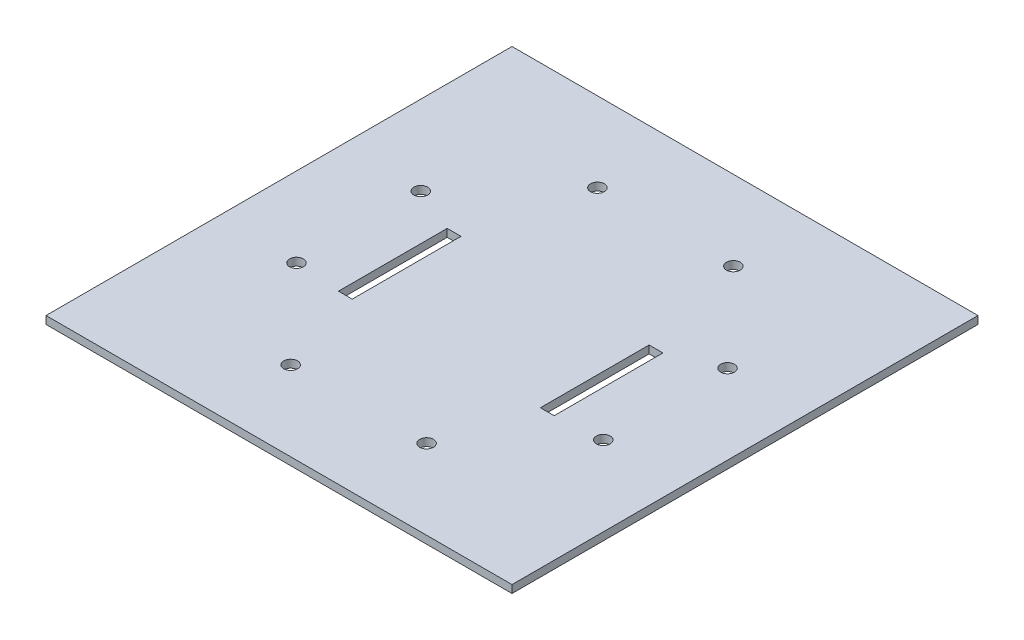
ISO-10303-21;
HEADER;
FILE_DESCRIPTION(('STEP AP214'),'2;1');
FILE_NAME('part.step','',(''),(''),'','','');
FILE_SCHEMA(('AUTOMOTIVE_DESIGN { 1 0 10303 214 1 1 1 1 }'));
ENDSEC;
DATA;
#1=APPLICATION_CONTEXT('core data for automotive mechanical design processes');
#2=APPLICATION_PROTOCOL_DEFINITION('international standard','automotive_design',2000,#1);
#3=PRODUCT_CONTEXT('',#1,'mechanical');
#4=PRODUCT('Part','Part','',(#3));
#5=PRODUCT_RELATED_PRODUCT_CATEGORY('part','',(#4));
#6=PRODUCT_DEFINITION_FORMATION('','',#4);
#7=PRODUCT_DEFINITION_CONTEXT('part definition',#1,'design');
#8=PRODUCT_DEFINITION('design','',#6,#7);
#9=PRODUCT_DEFINITION_SHAPE('','',#8);
#10=(LENGTH_UNIT() NAMED_UNIT(*) SI_UNIT(.MILLI.,.METRE.));
#11=(NAMED_UNIT(*) PLANE_ANGLE_UNIT() SI_UNIT($,.RADIAN.));
#12=(NAMED_UNIT(*) SI_UNIT($,.STERADIAN.) SOLID_ANGLE_UNIT());
#13=UNCERTAINTY_MEASURE_WITH_UNIT(LENGTH_MEASURE(1.E-05),#10,'distance_accuracy_value','');
#14=(GEOMETRIC_REPRESENTATION_CONTEXT(3) GLOBAL_UNCERTAINTY_ASSIGNED_CONTEXT((#13)) GLOBAL_UNIT_ASSIGNED_CONTEXT((#10,
#11,#12)) REPRESENTATION_CONTEXT('',''));
#15=CARTESIAN_POINT('',(0.,0.,0.));
#16=DIRECTION('',(0.,0.,1.));
#17=DIRECTION('',(1.,0.,0.));
#18=AXIS2_PLACEMENT_3D('',#15,#16,#17);
#19=CARTESIAN_POINT('',(44.8799955021159,2.,-74.7331424372196));
#20=DIRECTION('',(1.,0.,0.));
#21=DIRECTION('',(0.,0.,-1.));
#22=AXIS2_PLACEMENT_3D('',#19,#20,#21);
#23=PLANE('',#22);
#24=DIRECTION('',(0.,0.,1.));
#25=VECTOR('',#24,1.);
#26=CARTESIAN_POINT('',(44.8799955021159,0.,-74.7331424372196));
#27=LINE('',#26,#25);
#28=CARTESIAN_POINT('',(44.8799955021159,0.,-74.7331424372196));
#29=VERTEX_POINT('',#28);
#30=CARTESIAN_POINT('',(44.879995502116,0.,45.2668575627803));
#31=VERTEX_POINT('',#30);
#32=EDGE_CURVE('E234',#29,#31,#27,.T.);
#33=ORIENTED_EDGE('',*,*,#32,.T.);
#34=DIRECTION('',(0.,-1.,0.));
#35=VECTOR('',#34,1.);
#36=CARTESIAN_POINT('',(44.879995502116,2.,45.2668575627803));
#37=LINE('',#36,#35);
#38=CARTESIAN_POINT('',(44.879995502116,2.,45.2668575627803));
#39=VERTEX_POINT('',#38);
#40=EDGE_CURVE('E11',#39,#31,#37,.T.);
#41=ORIENTED_EDGE('',*,*,#40,.F.);
#42=DIRECTION('',(0.,0.,1.));
#43=VECTOR('',#42,1.);
#44=CARTESIAN_POINT('',(44.8799955021159,2.,-74.7331424372196));
#45=LINE('',#44,#43);
#46=CARTESIAN_POINT('',(44.8799955021159,2.,-74.7331424372196));
#47=VERTEX_POINT('',#46);
#48=EDGE_CURVE('E237',#47,#39,#45,.T.);
#49=ORIENTED_EDGE('',*,*,#48,.F.);
#50=DIRECTION('',(0.,-1.,0.));
#51=VECTOR('',#50,1.);
#52=CARTESIAN_POINT('',(44.8799955021159,2.,-74.7331424372196));
#53=LINE('',#52,#51);
#54=EDGE_CURVE('E247',#47,#29,#53,.T.);
#55=ORIENTED_EDGE('',*,*,#54,.T.);
#56=EDGE_LOOP('',(#33,#41,#49,#55));
#57=FACE_BOUND('',#56,.T.);
#58=ADVANCED_FACE('F32',(#57),#23,.F.);
#59=CARTESIAN_POINT('',(44.879995502116,2.,45.2668575627803));
#60=DIRECTION('',(0.,0.,-1.));
#61=DIRECTION('',(-1.,0.,0.));
#62=AXIS2_PLACEMENT_3D('',#59,#60,#61);
#63=PLANE('',#62);
#64=DIRECTION('',(1.,0.,0.));
#65=VECTOR('',#64,1.);
#66=CARTESIAN_POINT('',(44.879995502116,0.,45.2668575627803));
#67=LINE('',#66,#65);
#68=CARTESIAN_POINT('',(164.879995502116,0.,45.2668575627803));
#69=VERTEX_POINT('',#68);
#70=EDGE_CURVE('E250',#31,#69,#67,.T.);
#71=ORIENTED_EDGE('',*,*,#70,.T.);
#72=DIRECTION('',(0.,-1.,0.));
#73=VECTOR('',#72,1.);
#74=CARTESIAN_POINT('',(164.879995502116,2.,45.2668575627803));
#75=LINE('',#74,#73);
#76=CARTESIAN_POINT('',(164.879995502116,2.,45.2668575627803));
#77=VERTEX_POINT('',#76);
#78=EDGE_CURVE('E39',#77,#69,#75,.T.);
#79=ORIENTED_EDGE('',*,*,#78,.F.);
#80=DIRECTION('',(1.,0.,0.));
#81=VECTOR('',#80,1.);
#82=CARTESIAN_POINT('',(44.879995502116,2.,45.2668575627803));
#83=LINE('',#82,#81);
#84=EDGE_CURVE('E240',#39,#77,#83,.T.);
#85=ORIENTED_EDGE('',*,*,#84,.F.);
#86=ORIENTED_EDGE('',*,*,#40,.T.);
#87=EDGE_LOOP('',(#71,#79,#85,#86));
#88=FACE_BOUND('',#87,.T.);
#89=ADVANCED_FACE('F279',(#88),#63,.F.);
#90=CARTESIAN_POINT('',(164.879995502116,2.,-74.7331424372197));
#91=DIRECTION('',(-1.,0.,0.));
#92=DIRECTION('',(0.,0.,1.));
#93=AXIS2_PLACEMENT_3D('',#90,#91,#92);
#94=PLANE('',#93);
#95=DIRECTION('',(0.,0.,-1.));
#96=VECTOR('',#95,1.);
#97=CARTESIAN_POINT('',(164.879995502116,0.,-74.7331424372197));
#98=LINE('',#97,#96);
#99=CARTESIAN_POINT('',(164.879995502116,0.,-74.7331424372197));
#100=VERTEX_POINT('',#99);
#101=EDGE_CURVE('E252',#69,#100,#98,.T.);
#102=ORIENTED_EDGE('',*,*,#101,.T.);
#103=DIRECTION('',(0.,-1.,0.));
#104=VECTOR('',#103,1.);
#105=CARTESIAN_POINT('',(164.879995502116,2.,-74.7331424372197));
#106=LINE('',#105,#104);
#107=CARTESIAN_POINT('',(164.879995502116,2.,-74.7331424372197));
#108=VERTEX_POINT('',#107);
#109=EDGE_CURVE('E257',#108,#100,#106,.T.);
#110=ORIENTED_EDGE('',*,*,#109,.F.);
#111=DIRECTION('',(0.,0.,-1.));
#112=VECTOR('',#111,1.);
#113=CARTESIAN_POINT('',(164.879995502116,2.,-74.7331424372197));
#114=LINE('',#113,#112);
#115=EDGE_CURVE('E243',#77,#108,#114,.T.);
#116=ORIENTED_EDGE('',*,*,#115,.F.);
#117=ORIENTED_EDGE('',*,*,#78,.T.);
#118=EDGE_LOOP('',(#102,#110,#116,#117));
#119=FACE_BOUND('',#118,.T.);
#120=ADVANCED_FACE('F264',(#119),#94,.F.);
#121=CARTESIAN_POINT('',(44.8799955021159,2.,-74.7331424372196));
#122=DIRECTION('',(0.,0.,1.));
#123=DIRECTION('',(1.,0.,0.));
#124=AXIS2_PLACEMENT_3D('',#121,#122,#123);
#125=PLANE('',#124);
#126=DIRECTION('',(-1.,0.,0.));
#127=VECTOR('',#126,1.);
#128=CARTESIAN_POINT('',(44.8799955021159,0.,-74.7331424372196));
#129=LINE('',#128,#127);
#130=EDGE_CURVE('E241',#100,#29,#129,.T.);
#131=ORIENTED_EDGE('',*,*,#130,.T.);
#132=ORIENTED_EDGE('',*,*,#54,.F.);
#133=DIRECTION('',(-1.,0.,0.));
#134=VECTOR('',#133,1.);
#135=CARTESIAN_POINT('',(44.8799955021159,2.,-74.7331424372196));
#136=LINE('',#135,#134);
#137=EDGE_CURVE('E245',#108,#47,#136,.T.);
#138=ORIENTED_EDGE('',*,*,#137,.F.);
#139=ORIENTED_EDGE('',*,*,#109,.T.);
#140=EDGE_LOOP('',(#131,#132,#138,#139));
#141=FACE_BOUND('',#140,.T.);
#142=ADVANCED_FACE('F272',(#141),#125,.F.);
#143=CARTESIAN_POINT('',(0.,2.,0.));
#144=DIRECTION('',(0.,1.,0.));
#145=DIRECTION('',(0.,0.,1.));
#146=AXIS2_PLACEMENT_3D('',#143,#144,#145);
#147=PLANE('',#146);
#148=DIRECTION('',(0.,0.,1.));
#149=VECTOR('',#148,1.);
#150=CARTESIAN_POINT('',(129.104995502116,2.,2.17958786240887));
#151=LINE('',#150,#149);
#152=CARTESIAN_POINT('',(129.104995502116,2.,-25.8204121375911));
#153=VERTEX_POINT('',#152);
#154=CARTESIAN_POINT('',(129.104995502116,2.,2.17958786240887));
#155=VERTEX_POINT('',#154);
#156=EDGE_CURVE('E46',#153,#155,#151,.T.);
#157=ORIENTED_EDGE('',*,*,#156,.F.);
#158=DIRECTION('',(-1.,0.,0.));
#159=VECTOR('',#158,1.);
#160=CARTESIAN_POINT('',(129.104995502116,2.,-25.8204121375911));
#161=LINE('',#160,#159);
#162=CARTESIAN_POINT('',(132.654995502116,2.,-25.8204121375911));
#163=VERTEX_POINT('',#162);
#164=EDGE_CURVE('E138',#163,#153,#161,.T.);
#165=ORIENTED_EDGE('',*,*,#164,.F.);
#166=DIRECTION('',(0.,0.,-1.));
#167=VECTOR('',#166,1.);
#168=CARTESIAN_POINT('',(132.654995502116,2.,2.17958786240887));
#169=LINE('',#168,#167);
#170=CARTESIAN_POINT('',(132.654995502116,2.,2.17958786240887));
#171=VERTEX_POINT('',#170);
#172=EDGE_CURVE('E141',#171,#163,#169,.T.);
#173=ORIENTED_EDGE('',*,*,#172,.F.);
#174=DIRECTION('',(1.,0.,0.));
#175=VECTOR('',#174,1.);
#176=CARTESIAN_POINT('',(129.104995502116,2.,2.17958786240887));
#177=LINE('',#176,#175);
#178=EDGE_CURVE('E147',#155,#171,#177,.T.);
#179=ORIENTED_EDGE('',*,*,#178,.F.);
#180=EDGE_LOOP('',(#157,#165,#173,#179));
#181=FACE_BOUND('',#180,.T.);
#182=DIRECTION('',(0.,0.,-1.));
#183=VECTOR('',#182,1.);
#184=CARTESIAN_POINT('',(80.6549955021159,2.,2.17958786240888));
#185=LINE('',#184,#183);
#186=CARTESIAN_POINT('',(80.6549955021159,2.,2.17958786240888));
#187=VERTEX_POINT('',#186);
#188=CARTESIAN_POINT('',(80.6549955021159,2.,-25.8204121375911));
#189=VERTEX_POINT('',#188);
#190=EDGE_CURVE('E153',#187,#189,#185,.T.);
#191=ORIENTED_EDGE('',*,*,#190,.F.);
#192=DIRECTION('',(1.,0.,0.));
#193=VECTOR('',#192,1.);
#194=CARTESIAN_POINT('',(80.6549955021159,2.,2.17958786240888));
#195=LINE('',#194,#193);
#196=CARTESIAN_POINT('',(77.1049955021159,2.,2.17958786240888));
#197=VERTEX_POINT('',#196);
#198=EDGE_CURVE('E161',#197,#187,#195,.T.);
#199=ORIENTED_EDGE('',*,*,#198,.F.);
#200=DIRECTION('',(0.,0.,1.));
#201=VECTOR('',#200,1.);
#202=CARTESIAN_POINT('',(77.1049955021159,2.,2.17958786240888));
#203=LINE('',#202,#201);
#204=CARTESIAN_POINT('',(77.1049955021159,2.,-25.8204121375911));
#205=VERTEX_POINT('',#204);
#206=EDGE_CURVE('E175',#205,#197,#203,.T.);
#207=ORIENTED_EDGE('',*,*,#206,.F.);
#208=DIRECTION('',(-1.,0.,0.));
#209=VECTOR('',#208,1.);
#210=CARTESIAN_POINT('',(80.6549955021159,2.,-25.8204121375911));
#211=LINE('',#210,#209);
#212=EDGE_CURVE('E172',#189,#205,#211,.T.);
#213=ORIENTED_EDGE('',*,*,#212,.F.);
#214=EDGE_LOOP('',(#191,#199,#207,#213));
#215=FACE_BOUND('',#214,.T.);
#216=CARTESIAN_POINT('',(122.379995502116,2.,-54.2331424372197));
#217=DIRECTION('',(0.,1.,0.));
#218=DIRECTION('',(0.,0.,1.));
#219=AXIS2_PLACEMENT_3D('',#216,#217,#218);
#220=CIRCLE('',#219,1.77499999999999);
#221=CARTESIAN_POINT('',(122.379995502116,2.,-52.4581424372197));
#222=VERTEX_POINT('',#221);
#223=EDGE_CURVE('E182',#222,#222,#220,.T.);
#224=ORIENTED_EDGE('',*,*,#223,.F.);
#225=EDGE_LOOP('',(#224));
#226=FACE_BOUND('',#225,.T.);
#227=CARTESIAN_POINT('',(122.379995502116,2.,24.7668575627803));
#228=DIRECTION('',(0.,1.,0.));
#229=DIRECTION('',(0.,0.,1.));
#230=AXIS2_PLACEMENT_3D('',#227,#228,#229);
#231=CIRCLE('',#230,1.77499999999999);
#232=CARTESIAN_POINT('',(122.379995502116,2.,26.5418575627803));
#233=VERTEX_POINT('',#232);
#234=EDGE_CURVE('E192',#233,#233,#231,.T.);
#235=ORIENTED_EDGE('',*,*,#234,.F.);
#236=EDGE_LOOP('',(#235));
#237=FACE_BOUND('',#236,.T.);
#238=CARTESIAN_POINT('',(87.3799955021159,2.,-54.2331424372197));
#239=DIRECTION('',(0.,1.,0.));
#240=DIRECTION('',(0.,0.,1.));
#241=AXIS2_PLACEMENT_3D('',#238,#239,#240);
#242=CIRCLE('',#241,1.77499999999999);
#243=CARTESIAN_POINT('',(87.3799955021159,2.,-52.4581424372197));
#244=VERTEX_POINT('',#243);
#245=EDGE_CURVE('E198',#244,#244,#242,.T.);
#246=ORIENTED_EDGE('',*,*,#245,.F.);
#247=EDGE_LOOP('',(#246));
#248=FACE_BOUND('',#247,.T.);
#249=CARTESIAN_POINT('',(87.3799955021159,2.,24.7668575627803));
#250=DIRECTION('',(0.,1.,0.));
#251=DIRECTION('',(0.,0.,1.));
#252=AXIS2_PLACEMENT_3D('',#249,#250,#251);
#253=CIRCLE('',#252,1.77499999999999);
#254=CARTESIAN_POINT('',(87.3799955021159,2.,26.5418575627803));
#255=VERTEX_POINT('',#254);
#256=EDGE_CURVE('E204',#255,#255,#253,.T.);
#257=ORIENTED_EDGE('',*,*,#256,.F.);
#258=EDGE_LOOP('',(#257));
#259=FACE_BOUND('',#258,.T.);
#260=CARTESIAN_POINT('',(144.379995502116,2.,-30.7331424372197));
#261=DIRECTION('',(0.,1.,0.));
#262=DIRECTION('',(0.,0.,1.));
#263=AXIS2_PLACEMENT_3D('',#260,#261,#262);
#264=CIRCLE('',#263,1.77499999999999);
#265=CARTESIAN_POINT('',(144.379995502116,2.,-28.9581424372197));
#266=VERTEX_POINT('',#265);
#267=EDGE_CURVE('E210',#266,#266,#264,.T.);
#268=ORIENTED_EDGE('',*,*,#267,.F.);
#269=EDGE_LOOP('',(#268));
#270=FACE_BOUND('',#269,.T.);
#271=CARTESIAN_POINT('',(144.379995502116,2.,1.2668575627803));
#272=DIRECTION('',(0.,1.,0.));
#273=DIRECTION('',(0.,0.,1.));
#274=AXIS2_PLACEMENT_3D('',#271,#272,#273);
#275=CIRCLE('',#274,1.775);
#276=CARTESIAN_POINT('',(144.379995502116,2.,3.0418575627803));
#277=VERTEX_POINT('',#276);
#278=EDGE_CURVE('E216',#277,#277,#275,.T.);
#279=ORIENTED_EDGE('',*,*,#278,.F.);
#280=EDGE_LOOP('',(#279));
#281=FACE_BOUND('',#280,.T.);
#282=CARTESIAN_POINT('',(65.3799955021159,2.,1.2668575627803));
#283=DIRECTION('',(0.,1.,0.));
#284=DIRECTION('',(0.,0.,1.));
#285=AXIS2_PLACEMENT_3D('',#282,#283,#284);
#286=CIRCLE('',#285,1.775);
#287=CARTESIAN_POINT('',(65.3799955021159,2.,3.0418575627803));
#288=VERTEX_POINT('',#287);
#289=EDGE_CURVE('E222',#288,#288,#286,.T.);
#290=ORIENTED_EDGE('',*,*,#289,.F.);
#291=EDGE_LOOP('',(#290));
#292=FACE_BOUND('',#291,.T.);
#293=CARTESIAN_POINT('',(65.3799955021159,2.,-30.7331424372197));
#294=DIRECTION('',(0.,1.,0.));
#295=DIRECTION('',(0.,0.,1.));
#296=AXIS2_PLACEMENT_3D('',#293,#294,#295);
#297=CIRCLE('',#296,1.77499999999999);
#298=CARTESIAN_POINT('',(65.3799955021159,2.,-28.9581424372197));
#299=VERTEX_POINT('',#298);
#300=EDGE_CURVE('E228',#299,#299,#297,.T.);
#301=ORIENTED_EDGE('',*,*,#300,.F.);
#302=EDGE_LOOP('',(#301));
#303=FACE_BOUND('',#302,.T.);
#304=ORIENTED_EDGE('',*,*,#48,.T.);
#305=ORIENTED_EDGE('',*,*,#84,.T.);
#306=ORIENTED_EDGE('',*,*,#115,.T.);
#307=ORIENTED_EDGE('',*,*,#137,.T.);
#308=EDGE_LOOP('',(#304,#305,#306,#307));
#309=FACE_BOUND('',#308,.T.);
#310=ADVANCED_FACE('F278',(#181,#215,#226,#237,#248,#259,#270,#281,#292,#303,#309),#147,.T.);
#311=CARTESIAN_POINT('',(0.,0.,0.));
#312=DIRECTION('',(0.,1.,0.));
#313=DIRECTION('',(0.,0.,1.));
#314=AXIS2_PLACEMENT_3D('',#311,#312,#313);
#315=PLANE('',#314);
#316=DIRECTION('',(-1.,0.,0.));
#317=VECTOR('',#316,1.);
#318=CARTESIAN_POINT('',(129.104995502116,0.,-25.8204121375911));
#319=LINE('',#318,#317);
#320=CARTESIAN_POINT('',(132.654995502116,0.,-25.8204121375911));
#321=VERTEX_POINT('',#320);
#322=CARTESIAN_POINT('',(129.104995502116,0.,-25.8204121375911));
#323=VERTEX_POINT('',#322);
#324=EDGE_CURVE('E128',#321,#323,#319,.T.);
#325=ORIENTED_EDGE('',*,*,#324,.T.);
#326=DIRECTION('',(0.,0.,1.));
#327=VECTOR('',#326,1.);
#328=CARTESIAN_POINT('',(129.104995502116,0.,2.17958786240887));
#329=LINE('',#328,#327);
#330=CARTESIAN_POINT('',(129.104995502116,0.,2.17958786240887));
#331=VERTEX_POINT('',#330);
#332=EDGE_CURVE('E122',#323,#331,#329,.T.);
#333=ORIENTED_EDGE('',*,*,#332,.T.);
#334=DIRECTION('',(1.,0.,0.));
#335=VECTOR('',#334,1.);
#336=CARTESIAN_POINT('',(129.104995502116,0.,2.17958786240887));
#337=LINE('',#336,#335);
#338=CARTESIAN_POINT('',(132.654995502116,0.,2.17958786240887));
#339=VERTEX_POINT('',#338);
#340=EDGE_CURVE('E131',#331,#339,#337,.T.);
#341=ORIENTED_EDGE('',*,*,#340,.T.);
#342=DIRECTION('',(0.,0.,-1.));
#343=VECTOR('',#342,1.);
#344=CARTESIAN_POINT('',(132.654995502116,0.,2.17958786240887));
#345=LINE('',#344,#343);
#346=EDGE_CURVE('E54',#339,#321,#345,.T.);
#347=ORIENTED_EDGE('',*,*,#346,.T.);
#348=EDGE_LOOP('',(#325,#333,#341,#347));
#349=FACE_BOUND('',#348,.T.);
#350=DIRECTION('',(1.,0.,0.));
#351=VECTOR('',#350,1.);
#352=CARTESIAN_POINT('',(80.6549955021159,0.,2.17958786240888));
#353=LINE('',#352,#351);
#354=CARTESIAN_POINT('',(77.1049955021159,0.,2.17958786240888));
#355=VERTEX_POINT('',#354);
#356=CARTESIAN_POINT('',(80.6549955021159,0.,2.17958786240888));
#357=VERTEX_POINT('',#356);
#358=EDGE_CURVE('E167',#355,#357,#353,.T.);
#359=ORIENTED_EDGE('',*,*,#358,.T.);
#360=DIRECTION('',(0.,0.,-1.));
#361=VECTOR('',#360,1.);
#362=CARTESIAN_POINT('',(80.6549955021159,0.,2.17958786240888));
#363=LINE('',#362,#361);
#364=CARTESIAN_POINT('',(80.6549955021159,0.,-25.8204121375911));
#365=VERTEX_POINT('',#364);
#366=EDGE_CURVE('E157',#357,#365,#363,.T.);
#367=ORIENTED_EDGE('',*,*,#366,.T.);
#368=DIRECTION('',(-1.,0.,0.));
#369=VECTOR('',#368,1.);
#370=CARTESIAN_POINT('',(80.6549955021159,0.,-25.8204121375911));
#371=LINE('',#370,#369);
#372=CARTESIAN_POINT('',(77.1049955021159,0.,-25.8204121375911));
#373=VERTEX_POINT('',#372);
#374=EDGE_CURVE('E160',#365,#373,#371,.T.);
#375=ORIENTED_EDGE('',*,*,#374,.T.);
#376=DIRECTION('',(0.,0.,1.));
#377=VECTOR('',#376,1.);
#378=CARTESIAN_POINT('',(77.1049955021159,0.,2.17958786240888));
#379=LINE('',#378,#377);
#380=EDGE_CURVE('E164',#373,#355,#379,.T.);
#381=ORIENTED_EDGE('',*,*,#380,.T.);
#382=EDGE_LOOP('',(#359,#367,#375,#381));
#383=FACE_BOUND('',#382,.T.);
#384=CARTESIAN_POINT('',(122.379995502116,0.,-54.2331424372197));
#385=DIRECTION('',(0.,1.,0.));
#386=DIRECTION('',(0.,0.,1.));
#387=AXIS2_PLACEMENT_3D('',#384,#385,#386);
#388=CIRCLE('',#387,1.77499999999999);
#389=CARTESIAN_POINT('',(122.379995502116,0.,-52.4581424372197));
#390=VERTEX_POINT('',#389);
#391=EDGE_CURVE('E189',#390,#390,#388,.T.);
#392=ORIENTED_EDGE('',*,*,#391,.T.);
#393=EDGE_LOOP('',(#392));
#394=FACE_BOUND('',#393,.T.);
#395=CARTESIAN_POINT('',(122.379995502116,0.,24.7668575627803));
#396=DIRECTION('',(0.,1.,0.));
#397=DIRECTION('',(0.,0.,1.));
#398=AXIS2_PLACEMENT_3D('',#395,#396,#397);
#399=CIRCLE('',#398,1.77499999999999);
#400=CARTESIAN_POINT('',(122.379995502116,0.,26.5418575627803));
#401=VERTEX_POINT('',#400);
#402=EDGE_CURVE('E195',#401,#401,#399,.T.);
#403=ORIENTED_EDGE('',*,*,#402,.T.);
#404=EDGE_LOOP('',(#403));
#405=FACE_BOUND('',#404,.T.);
#406=CARTESIAN_POINT('',(87.3799955021159,0.,-54.2331424372197));
#407=DIRECTION('',(0.,1.,0.));
#408=DIRECTION('',(0.,0.,1.));
#409=AXIS2_PLACEMENT_3D('',#406,#407,#408);
#410=CIRCLE('',#409,1.77499999999999);
#411=CARTESIAN_POINT('',(87.3799955021159,0.,-52.4581424372197));
#412=VERTEX_POINT('',#411);
#413=EDGE_CURVE('E201',#412,#412,#410,.T.);
#414=ORIENTED_EDGE('',*,*,#413,.T.);
#415=EDGE_LOOP('',(#414));
#416=FACE_BOUND('',#415,.T.);
#417=CARTESIAN_POINT('',(87.3799955021159,0.,24.7668575627803));
#418=DIRECTION('',(0.,1.,0.));
#419=DIRECTION('',(0.,0.,1.));
#420=AXIS2_PLACEMENT_3D('',#417,#418,#419);
#421=CIRCLE('',#420,1.77499999999999);
#422=CARTESIAN_POINT('',(87.3799955021159,0.,26.5418575627803));
#423=VERTEX_POINT('',#422);
#424=EDGE_CURVE('E207',#423,#423,#421,.T.);
#425=ORIENTED_EDGE('',*,*,#424,.T.);
#426=EDGE_LOOP('',(#425));
#427=FACE_BOUND('',#426,.T.);
#428=CARTESIAN_POINT('',(144.379995502116,0.,-30.7331424372197));
#429=DIRECTION('',(0.,1.,0.));
#430=DIRECTION('',(0.,0.,1.));
#431=AXIS2_PLACEMENT_3D('',#428,#429,#430);
#432=CIRCLE('',#431,1.77499999999999);
#433=CARTESIAN_POINT('',(144.379995502116,0.,-28.9581424372197));
#434=VERTEX_POINT('',#433);
#435=EDGE_CURVE('E213',#434,#434,#432,.T.);
#436=ORIENTED_EDGE('',*,*,#435,.T.);
#437=EDGE_LOOP('',(#436));
#438=FACE_BOUND('',#437,.T.);
#439=CARTESIAN_POINT('',(144.379995502116,0.,1.2668575627803));
#440=DIRECTION('',(0.,1.,0.));
#441=DIRECTION('',(0.,0.,1.));
#442=AXIS2_PLACEMENT_3D('',#439,#440,#441);
#443=CIRCLE('',#442,1.775);
#444=CARTESIAN_POINT('',(144.379995502116,0.,3.0418575627803));
#445=VERTEX_POINT('',#444);
#446=EDGE_CURVE('E219',#445,#445,#443,.T.);
#447=ORIENTED_EDGE('',*,*,#446,.T.);
#448=EDGE_LOOP('',(#447));
#449=FACE_BOUND('',#448,.T.);
#450=CARTESIAN_POINT('',(65.3799955021159,0.,1.2668575627803));
#451=DIRECTION('',(0.,1.,0.));
#452=DIRECTION('',(0.,0.,1.));
#453=AXIS2_PLACEMENT_3D('',#450,#451,#452);
#454=CIRCLE('',#453,1.775);
#455=CARTESIAN_POINT('',(65.3799955021159,0.,3.0418575627803));
#456=VERTEX_POINT('',#455);
#457=EDGE_CURVE('E225',#456,#456,#454,.T.);
#458=ORIENTED_EDGE('',*,*,#457,.T.);
#459=EDGE_LOOP('',(#458));
#460=FACE_BOUND('',#459,.T.);
#461=CARTESIAN_POINT('',(65.3799955021159,0.,-30.7331424372197));
#462=DIRECTION('',(0.,1.,0.));
#463=DIRECTION('',(0.,0.,1.));
#464=AXIS2_PLACEMENT_3D('',#461,#462,#463);
#465=CIRCLE('',#464,1.77499999999999);
#466=CARTESIAN_POINT('',(65.3799955021159,0.,-28.9581424372197));
#467=VERTEX_POINT('',#466);
#468=EDGE_CURVE('E231',#467,#467,#465,.T.);
#469=ORIENTED_EDGE('',*,*,#468,.T.);
#470=EDGE_LOOP('',(#469));
#471=FACE_BOUND('',#470,.T.);
#472=ORIENTED_EDGE('',*,*,#32,.F.);
#473=ORIENTED_EDGE('',*,*,#130,.F.);
#474=ORIENTED_EDGE('',*,*,#101,.F.);
#475=ORIENTED_EDGE('',*,*,#70,.F.);
#476=EDGE_LOOP('',(#472,#473,#474,#475));
#477=FACE_BOUND('',#476,.T.);
#478=ADVANCED_FACE('F135',(#349,#383,#394,#405,#416,#427,#438,#449,#460,#471,#477),#315,.F.);
#479=CARTESIAN_POINT('',(65.3799955021159,0.,-30.7331424372197));
#480=DIRECTION('',(0.,1.,0.));
#481=DIRECTION('',(0.,0.,1.));
#482=AXIS2_PLACEMENT_3D('',#479,#480,#481);
#483=CYLINDRICAL_SURFACE('',#482,1.77499999999999);
#484=ORIENTED_EDGE('',*,*,#468,.F.);
#485=EDGE_LOOP('',(#484));
#486=FACE_BOUND('',#485,.T.);
#487=ORIENTED_EDGE('',*,*,#300,.T.);
#488=EDGE_LOOP('',(#487));
#489=FACE_BOUND('',#488,.T.);
#490=ADVANCED_FACE('F291',(#486,#489),#483,.F.);
#491=CARTESIAN_POINT('',(65.3799955021159,0.,1.2668575627803));
#492=DIRECTION('',(0.,1.,0.));
#493=DIRECTION('',(0.,0.,1.));
#494=AXIS2_PLACEMENT_3D('',#491,#492,#493);
#495=CYLINDRICAL_SURFACE('',#494,1.775);
#496=ORIENTED_EDGE('',*,*,#457,.F.);
#497=EDGE_LOOP('',(#496));
#498=FACE_BOUND('',#497,.T.);
#499=ORIENTED_EDGE('',*,*,#289,.T.);
#500=EDGE_LOOP('',(#499));
#501=FACE_BOUND('',#500,.T.);
#502=ADVANCED_FACE('F297',(#498,#501),#495,.F.);
#503=CARTESIAN_POINT('',(144.379995502116,0.,1.2668575627803));
#504=DIRECTION('',(0.,1.,0.));
#505=DIRECTION('',(0.,0.,1.));
#506=AXIS2_PLACEMENT_3D('',#503,#504,#505);
#507=CYLINDRICAL_SURFACE('',#506,1.775);
#508=ORIENTED_EDGE('',*,*,#446,.F.);
#509=EDGE_LOOP('',(#508));
#510=FACE_BOUND('',#509,.T.);
#511=ORIENTED_EDGE('',*,*,#278,.T.);
#512=EDGE_LOOP('',(#511));
#513=FACE_BOUND('',#512,.T.);
#514=ADVANCED_FACE('F301',(#510,#513),#507,.F.);
#515=CARTESIAN_POINT('',(144.379995502116,0.,-30.7331424372197));
#516=DIRECTION('',(0.,1.,0.));
#517=DIRECTION('',(0.,0.,1.));
#518=AXIS2_PLACEMENT_3D('',#515,#516,#517);
#519=CYLINDRICAL_SURFACE('',#518,1.77499999999999);
#520=ORIENTED_EDGE('',*,*,#435,.F.);
#521=EDGE_LOOP('',(#520));
#522=FACE_BOUND('',#521,.T.);
#523=ORIENTED_EDGE('',*,*,#267,.T.);
#524=EDGE_LOOP('',(#523));
#525=FACE_BOUND('',#524,.T.);
#526=ADVANCED_FACE('F305',(#522,#525),#519,.F.);
#527=CARTESIAN_POINT('',(87.3799955021159,0.,24.7668575627803));
#528=DIRECTION('',(0.,1.,0.));
#529=DIRECTION('',(0.,0.,1.));
#530=AXIS2_PLACEMENT_3D('',#527,#528,#529);
#531=CYLINDRICAL_SURFACE('',#530,1.77499999999999);
#532=ORIENTED_EDGE('',*,*,#424,.F.);
#533=EDGE_LOOP('',(#532));
#534=FACE_BOUND('',#533,.T.);
#535=ORIENTED_EDGE('',*,*,#256,.T.);
#536=EDGE_LOOP('',(#535));
#537=FACE_BOUND('',#536,.T.);
#538=ADVANCED_FACE('F309',(#534,#537),#531,.F.);
#539=CARTESIAN_POINT('',(87.3799955021159,0.,-54.2331424372197));
#540=DIRECTION('',(0.,1.,0.));
#541=DIRECTION('',(0.,0.,1.));
#542=AXIS2_PLACEMENT_3D('',#539,#540,#541);
#543=CYLINDRICAL_SURFACE('',#542,1.77499999999999);
#544=ORIENTED_EDGE('',*,*,#413,.F.);
#545=EDGE_LOOP('',(#544));
#546=FACE_BOUND('',#545,.T.);
#547=ORIENTED_EDGE('',*,*,#245,.T.);
#548=EDGE_LOOP('',(#547));
#549=FACE_BOUND('',#548,.T.);
#550=ADVANCED_FACE('F313',(#546,#549),#543,.F.);
#551=CARTESIAN_POINT('',(122.379995502116,0.,24.7668575627803));
#552=DIRECTION('',(0.,1.,0.));
#553=DIRECTION('',(0.,0.,1.));
#554=AXIS2_PLACEMENT_3D('',#551,#552,#553);
#555=CYLINDRICAL_SURFACE('',#554,1.77499999999999);
#556=ORIENTED_EDGE('',*,*,#402,.F.);
#557=EDGE_LOOP('',(#556));
#558=FACE_BOUND('',#557,.T.);
#559=ORIENTED_EDGE('',*,*,#234,.T.);
#560=EDGE_LOOP('',(#559));
#561=FACE_BOUND('',#560,.T.);
#562=ADVANCED_FACE('F317',(#558,#561),#555,.F.);
#563=CARTESIAN_POINT('',(122.379995502116,0.,-54.2331424372197));
#564=DIRECTION('',(0.,1.,0.));
#565=DIRECTION('',(0.,0.,1.));
#566=AXIS2_PLACEMENT_3D('',#563,#564,#565);
#567=CYLINDRICAL_SURFACE('',#566,1.77499999999999);
#568=ORIENTED_EDGE('',*,*,#391,.F.);
#569=EDGE_LOOP('',(#568));
#570=FACE_BOUND('',#569,.T.);
#571=ORIENTED_EDGE('',*,*,#223,.T.);
#572=EDGE_LOOP('',(#571));
#573=FACE_BOUND('',#572,.T.);
#574=ADVANCED_FACE('F321',(#570,#573),#567,.F.);
#575=CARTESIAN_POINT('',(80.6549955021159,0.,2.17958786240888));
#576=DIRECTION('',(1.,0.,0.));
#577=DIRECTION('',(0.,0.,-1.));
#578=AXIS2_PLACEMENT_3D('',#575,#576,#577);
#579=PLANE('',#578);
#580=ORIENTED_EDGE('',*,*,#190,.T.);
#581=DIRECTION('',(0.,1.,0.));
#582=VECTOR('',#581,1.);
#583=CARTESIAN_POINT('',(80.6549955021159,0.,-25.8204121375911));
#584=LINE('',#583,#582);
#585=EDGE_CURVE('E170',#365,#189,#584,.T.);
#586=ORIENTED_EDGE('',*,*,#585,.F.);
#587=ORIENTED_EDGE('',*,*,#366,.F.);
#588=DIRECTION('',(0.,1.,0.));
#589=VECTOR('',#588,1.);
#590=CARTESIAN_POINT('',(80.6549955021159,0.,2.17958786240888));
#591=LINE('',#590,#589);
#592=EDGE_CURVE('E180',#357,#187,#591,.T.);
#593=ORIENTED_EDGE('',*,*,#592,.T.);
#594=EDGE_LOOP('',(#580,#586,#587,#593));
#595=FACE_BOUND('',#594,.T.);
#596=ADVANCED_FACE('F325',(#595),#579,.F.);
#597=CARTESIAN_POINT('',(80.6549955021159,0.,2.17958786240888));
#598=DIRECTION('',(0.,0.,1.));
#599=DIRECTION('',(1.,0.,0.));
#600=AXIS2_PLACEMENT_3D('',#597,#598,#599);
#601=PLANE('',#600);
#602=ORIENTED_EDGE('',*,*,#198,.T.);
#603=ORIENTED_EDGE('',*,*,#592,.F.);
#604=ORIENTED_EDGE('',*,*,#358,.F.);
#605=DIRECTION('',(0.,1.,0.));
#606=VECTOR('',#605,1.);
#607=CARTESIAN_POINT('',(77.1049955021159,0.,2.17958786240888));
#608=LINE('',#607,#606);
#609=EDGE_CURVE('E183',#355,#197,#608,.T.);
#610=ORIENTED_EDGE('',*,*,#609,.T.);
#611=EDGE_LOOP('',(#602,#603,#604,#610));
#612=FACE_BOUND('',#611,.T.);
#613=ADVANCED_FACE('F329',(#612),#601,.F.);
#614=CARTESIAN_POINT('',(77.1049955021159,0.,2.17958786240888));
#615=DIRECTION('',(-1.,0.,0.));
#616=DIRECTION('',(0.,0.,1.));
#617=AXIS2_PLACEMENT_3D('',#614,#615,#616);
#618=PLANE('',#617);
#619=ORIENTED_EDGE('',*,*,#206,.T.);
#620=ORIENTED_EDGE('',*,*,#609,.F.);
#621=ORIENTED_EDGE('',*,*,#380,.F.);
#622=DIRECTION('',(0.,1.,0.));
#623=VECTOR('',#622,1.);
#624=CARTESIAN_POINT('',(77.1049955021159,0.,-25.8204121375911));
#625=LINE('',#624,#623);
#626=EDGE_CURVE('E185',#373,#205,#625,.T.);
#627=ORIENTED_EDGE('',*,*,#626,.T.);
#628=EDGE_LOOP('',(#619,#620,#621,#627));
#629=FACE_BOUND('',#628,.T.);
#630=ADVANCED_FACE('F334',(#629),#618,.F.);
#631=CARTESIAN_POINT('',(80.6549955021159,0.,-25.8204121375911));
#632=DIRECTION('',(0.,0.,-1.));
#633=DIRECTION('',(-1.,0.,0.));
#634=AXIS2_PLACEMENT_3D('',#631,#632,#633);
#635=PLANE('',#634);
#636=ORIENTED_EDGE('',*,*,#212,.T.);
#637=ORIENTED_EDGE('',*,*,#626,.F.);
#638=ORIENTED_EDGE('',*,*,#374,.F.);
#639=ORIENTED_EDGE('',*,*,#585,.T.);
#640=EDGE_LOOP('',(#636,#637,#638,#639));
#641=FACE_BOUND('',#640,.T.);
#642=ADVANCED_FACE('F331',(#641),#635,.F.);
#643=CARTESIAN_POINT('',(129.104995502116,0.,2.17958786240887));
#644=DIRECTION('',(-1.,0.,0.));
#645=DIRECTION('',(0.,0.,1.));
#646=AXIS2_PLACEMENT_3D('',#643,#644,#645);
#647=PLANE('',#646);
#648=ORIENTED_EDGE('',*,*,#156,.T.);
#649=DIRECTION('',(0.,1.,0.));
#650=VECTOR('',#649,1.);
#651=CARTESIAN_POINT('',(129.104995502116,0.,2.17958786240887));
#652=LINE('',#651,#650);
#653=EDGE_CURVE('E118',#331,#155,#652,.T.);
#654=ORIENTED_EDGE('',*,*,#653,.F.);
#655=ORIENTED_EDGE('',*,*,#332,.F.);
#656=DIRECTION('',(0.,1.,0.));
#657=VECTOR('',#656,1.);
#658=CARTESIAN_POINT('',(129.104995502116,0.,-25.8204121375911));
#659=LINE('',#658,#657);
#660=EDGE_CURVE('E151',#323,#153,#659,.T.);
#661=ORIENTED_EDGE('',*,*,#660,.T.);
#662=EDGE_LOOP('',(#648,#654,#655,#661));
#663=FACE_BOUND('',#662,.T.);
#664=ADVANCED_FACE('F120',(#663),#647,.F.);
#665=CARTESIAN_POINT('',(129.104995502116,0.,-25.8204121375911));
#666=DIRECTION('',(0.,0.,-1.));
#667=DIRECTION('',(-1.,0.,0.));
#668=AXIS2_PLACEMENT_3D('',#665,#666,#667);
#669=PLANE('',#668);
#670=ORIENTED_EDGE('',*,*,#164,.T.);
#671=ORIENTED_EDGE('',*,*,#660,.F.);
#672=ORIENTED_EDGE('',*,*,#324,.F.);
#673=DIRECTION('',(0.,1.,0.));
#674=VECTOR('',#673,1.);
#675=CARTESIAN_POINT('',(132.654995502116,0.,-25.8204121375911));
#676=LINE('',#675,#674);
#677=EDGE_CURVE('E154',#321,#163,#676,.T.);
#678=ORIENTED_EDGE('',*,*,#677,.T.);
#679=EDGE_LOOP('',(#670,#671,#672,#678));
#680=FACE_BOUND('',#679,.T.);
#681=ADVANCED_FACE('F344',(#680),#669,.F.);
#682=CARTESIAN_POINT('',(132.654995502116,0.,2.17958786240887));
#683=DIRECTION('',(1.,0.,0.));
#684=DIRECTION('',(0.,0.,-1.));
#685=AXIS2_PLACEMENT_3D('',#682,#683,#684);
#686=PLANE('',#685);
#687=ORIENTED_EDGE('',*,*,#172,.T.);
#688=ORIENTED_EDGE('',*,*,#677,.F.);
#689=ORIENTED_EDGE('',*,*,#346,.F.);
#690=DIRECTION('',(0.,1.,0.));
#691=VECTOR('',#690,1.);
#692=CARTESIAN_POINT('',(132.654995502116,0.,2.17958786240887));
#693=LINE('',#692,#691);
#694=EDGE_CURVE('E127',#339,#171,#693,.T.);
#695=ORIENTED_EDGE('',*,*,#694,.T.);
#696=EDGE_LOOP('',(#687,#688,#689,#695));
#697=FACE_BOUND('',#696,.T.);
#698=ADVANCED_FACE('F347',(#697),#686,.F.);
#699=CARTESIAN_POINT('',(129.104995502116,0.,2.17958786240887));
#700=DIRECTION('',(0.,0.,1.));
#701=DIRECTION('',(1.,0.,0.));
#702=AXIS2_PLACEMENT_3D('',#699,#700,#701);
#703=PLANE('',#702);
#704=ORIENTED_EDGE('',*,*,#178,.T.);
#705=ORIENTED_EDGE('',*,*,#694,.F.);
#706=ORIENTED_EDGE('',*,*,#340,.F.);
#707=ORIENTED_EDGE('',*,*,#653,.T.);
#708=EDGE_LOOP('',(#704,#705,#706,#707));
#709=FACE_BOUND('',#708,.T.);
#710=ADVANCED_FACE('F132',(#709),#703,.F.);
#711=CLOSED_SHELL('',(#58,#89,#120,#142,#310,#478,#490,#502,#514,#526,#538,#550,#562,#574,#596,
#613,#630,#642,#664,#681,#698,#710));
#712=MANIFOLD_SOLID_BREP('B2',#711);
#713=ADVANCED_BREP_SHAPE_REPRESENTATION('',(#18,#712),#14);
#714=SHAPE_DEFINITION_REPRESENTATION(#9,#713);
ENDSEC;
END-ISO-10303-21;
